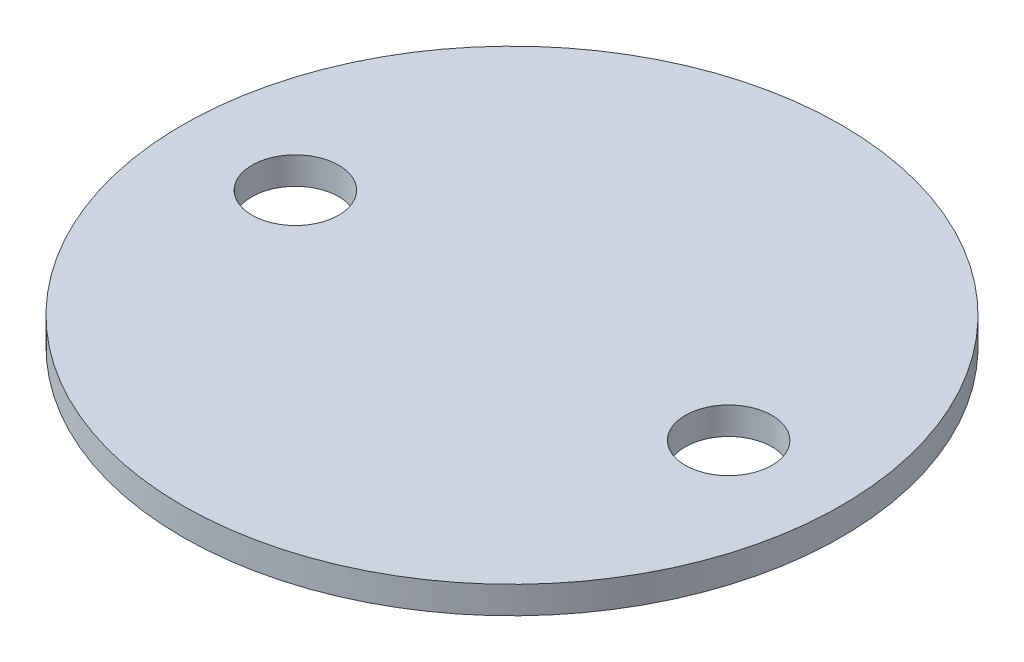
ISO-10303-21;
HEADER;
FILE_DESCRIPTION(('STEP AP214'),'2;1');
FILE_NAME('part.step','',(''),(''),'','','');
FILE_SCHEMA(('AUTOMOTIVE_DESIGN { 1 0 10303 214 1 1 1 1 }'));
ENDSEC;
DATA;
#1=APPLICATION_CONTEXT('core data for automotive mechanical design processes');
#2=APPLICATION_PROTOCOL_DEFINITION('international standard','automotive_design',2000,#1);
#3=PRODUCT_CONTEXT('',#1,'mechanical');
#4=PRODUCT('Part','Part','',(#3));
#5=PRODUCT_RELATED_PRODUCT_CATEGORY('part','',(#4));
#6=PRODUCT_DEFINITION_FORMATION('','',#4);
#7=PRODUCT_DEFINITION_CONTEXT('part definition',#1,'design');
#8=PRODUCT_DEFINITION('design','',#6,#7);
#9=PRODUCT_DEFINITION_SHAPE('','',#8);
#10=(LENGTH_UNIT() NAMED_UNIT(*) SI_UNIT(.MILLI.,.METRE.));
#11=(NAMED_UNIT(*) PLANE_ANGLE_UNIT() SI_UNIT($,.RADIAN.));
#12=(NAMED_UNIT(*) SI_UNIT($,.STERADIAN.) SOLID_ANGLE_UNIT());
#13=UNCERTAINTY_MEASURE_WITH_UNIT(LENGTH_MEASURE(1.E-05),#10,'distance_accuracy_value','');
#14=(GEOMETRIC_REPRESENTATION_CONTEXT(3) GLOBAL_UNCERTAINTY_ASSIGNED_CONTEXT((#13)) GLOBAL_UNIT_ASSIGNED_CONTEXT((#10,
#11,#12)) REPRESENTATION_CONTEXT('',''));
#15=CARTESIAN_POINT('',(0.,0.,0.));
#16=DIRECTION('',(0.,0.,1.));
#17=DIRECTION('',(1.,0.,0.));
#18=AXIS2_PLACEMENT_3D('',#15,#16,#17);
#19=CARTESIAN_POINT('',(0.,2.,0.));
#20=DIRECTION('',(0.,1.,0.));
#21=DIRECTION('',(0.,0.,1.));
#22=AXIS2_PLACEMENT_3D('',#19,#20,#21);
#23=PLANE('',#22);
#24=CARTESIAN_POINT('',(-15.875,2.,0.));
#25=DIRECTION('',(0.,1.,0.));
#26=DIRECTION('',(0.,0.,1.));
#27=AXIS2_PLACEMENT_3D('',#24,#25,#26);
#28=CIRCLE('',#27,3.175);
#29=CARTESIAN_POINT('',(-15.875,2.,3.175));
#30=VERTEX_POINT('',#29);
#31=EDGE_CURVE('E45',#30,#30,#28,.T.);
#32=ORIENTED_EDGE('',*,*,#31,.F.);
#33=EDGE_LOOP('',(#32));
#34=FACE_BOUND('',#33,.T.);
#35=CARTESIAN_POINT('',(0.,2.,0.));
#36=DIRECTION('',(0.,1.,0.));
#37=DIRECTION('',(0.,0.,1.));
#38=AXIS2_PLACEMENT_3D('',#35,#36,#37);
#39=CIRCLE('',#38,24.15);
#40=CARTESIAN_POINT('',(0.,2.,24.15));
#41=VERTEX_POINT('',#40);
#42=EDGE_CURVE('E10',#41,#41,#39,.T.);
#43=ORIENTED_EDGE('',*,*,#42,.T.);
#44=EDGE_LOOP('',(#43));
#45=FACE_BOUND('',#44,.T.);
#46=CARTESIAN_POINT('',(15.875,2.,0.));
#47=DIRECTION('',(0.,1.,0.));
#48=DIRECTION('',(0.,0.,1.));
#49=AXIS2_PLACEMENT_3D('',#46,#47,#48);
#50=CIRCLE('',#49,3.175);
#51=CARTESIAN_POINT('',(15.875,2.,3.175));
#52=VERTEX_POINT('',#51);
#53=EDGE_CURVE('E50',#52,#52,#50,.T.);
#54=ORIENTED_EDGE('',*,*,#53,.F.);
#55=EDGE_LOOP('',(#54));
#56=FACE_BOUND('',#55,.T.);
#57=ADVANCED_FACE('F34',(#34,#45,#56),#23,.T.);
#58=CARTESIAN_POINT('',(0.,0.,0.));
#59=DIRECTION('',(0.,1.,0.));
#60=DIRECTION('',(0.,0.,1.));
#61=AXIS2_PLACEMENT_3D('',#58,#59,#60);
#62=PLANE('',#61);
#63=CARTESIAN_POINT('',(0.,0.,0.));
#64=DIRECTION('',(0.,1.,0.));
#65=DIRECTION('',(0.,0.,1.));
#66=AXIS2_PLACEMENT_3D('',#63,#64,#65);
#67=CIRCLE('',#66,24.15);
#68=CARTESIAN_POINT('',(0.,0.,24.15));
#69=VERTEX_POINT('',#68);
#70=EDGE_CURVE('E38',#69,#69,#67,.T.);
#71=ORIENTED_EDGE('',*,*,#70,.F.);
#72=EDGE_LOOP('',(#71));
#73=FACE_BOUND('',#72,.T.);
#74=CARTESIAN_POINT('',(-15.875,0.,0.));
#75=DIRECTION('',(0.,1.,0.));
#76=DIRECTION('',(0.,0.,1.));
#77=AXIS2_PLACEMENT_3D('',#74,#75,#76);
#78=CIRCLE('',#77,3.175);
#79=CARTESIAN_POINT('',(-15.875,0.,3.175));
#80=VERTEX_POINT('',#79);
#81=EDGE_CURVE('E47',#80,#80,#78,.T.);
#82=ORIENTED_EDGE('',*,*,#81,.T.);
#83=EDGE_LOOP('',(#82));
#84=FACE_BOUND('',#83,.T.);
#85=CARTESIAN_POINT('',(15.875,0.,0.));
#86=DIRECTION('',(0.,1.,0.));
#87=DIRECTION('',(0.,0.,1.));
#88=AXIS2_PLACEMENT_3D('',#85,#86,#87);
#89=CIRCLE('',#88,3.175);
#90=CARTESIAN_POINT('',(15.875,0.,3.175));
#91=VERTEX_POINT('',#90);
#92=EDGE_CURVE('E53',#91,#91,#89,.T.);
#93=ORIENTED_EDGE('',*,*,#92,.T.);
#94=EDGE_LOOP('',(#93));
#95=FACE_BOUND('',#94,.T.);
#96=ADVANCED_FACE('F63',(#73,#84,#95),#62,.F.);
#97=CARTESIAN_POINT('',(0.,2.,0.));
#98=DIRECTION('',(0.,-1.,0.));
#99=DIRECTION('',(0.,0.,-1.));
#100=AXIS2_PLACEMENT_3D('',#97,#98,#99);
#101=CYLINDRICAL_SURFACE('',#100,24.15);
#102=ORIENTED_EDGE('',*,*,#42,.F.);
#103=EDGE_LOOP('',(#102));
#104=FACE_BOUND('',#103,.T.);
#105=ORIENTED_EDGE('',*,*,#70,.T.);
#106=EDGE_LOOP('',(#105));
#107=FACE_BOUND('',#106,.T.);
#108=ADVANCED_FACE('F36',(#104,#107),#101,.T.);
#109=CARTESIAN_POINT('',(-15.875,2.,0.));
#110=DIRECTION('',(0.,-1.,0.));
#111=DIRECTION('',(0.,0.,-1.));
#112=AXIS2_PLACEMENT_3D('',#109,#110,#111);
#113=CYLINDRICAL_SURFACE('',#112,3.175);
#114=ORIENTED_EDGE('',*,*,#31,.T.);
#115=EDGE_LOOP('',(#114));
#116=FACE_BOUND('',#115,.T.);
#117=ORIENTED_EDGE('',*,*,#81,.F.);
#118=EDGE_LOOP('',(#117));
#119=FACE_BOUND('',#118,.T.);
#120=ADVANCED_FACE('F72',(#116,#119),#113,.F.);
#121=CARTESIAN_POINT('',(15.875,2.,0.));
#122=DIRECTION('',(0.,-1.,0.));
#123=DIRECTION('',(0.,0.,-1.));
#124=AXIS2_PLACEMENT_3D('',#121,#122,#123);
#125=CYLINDRICAL_SURFACE('',#124,3.175);
#126=ORIENTED_EDGE('',*,*,#53,.T.);
#127=EDGE_LOOP('',(#126));
#128=FACE_BOUND('',#127,.T.);
#129=ORIENTED_EDGE('',*,*,#92,.F.);
#130=EDGE_LOOP('',(#129));
#131=FACE_BOUND('',#130,.T.);
#132=ADVANCED_FACE('F59',(#128,#131),#125,.F.);
#133=CLOSED_SHELL('',(#57,#96,#108,#120,#132));
#134=MANIFOLD_SOLID_BREP('B2',#133);
#135=ADVANCED_BREP_SHAPE_REPRESENTATION('',(#18,#134),#14);
#136=SHAPE_DEFINITION_REPRESENTATION(#9,#135);
ENDSEC;
END-ISO-10303-21;
